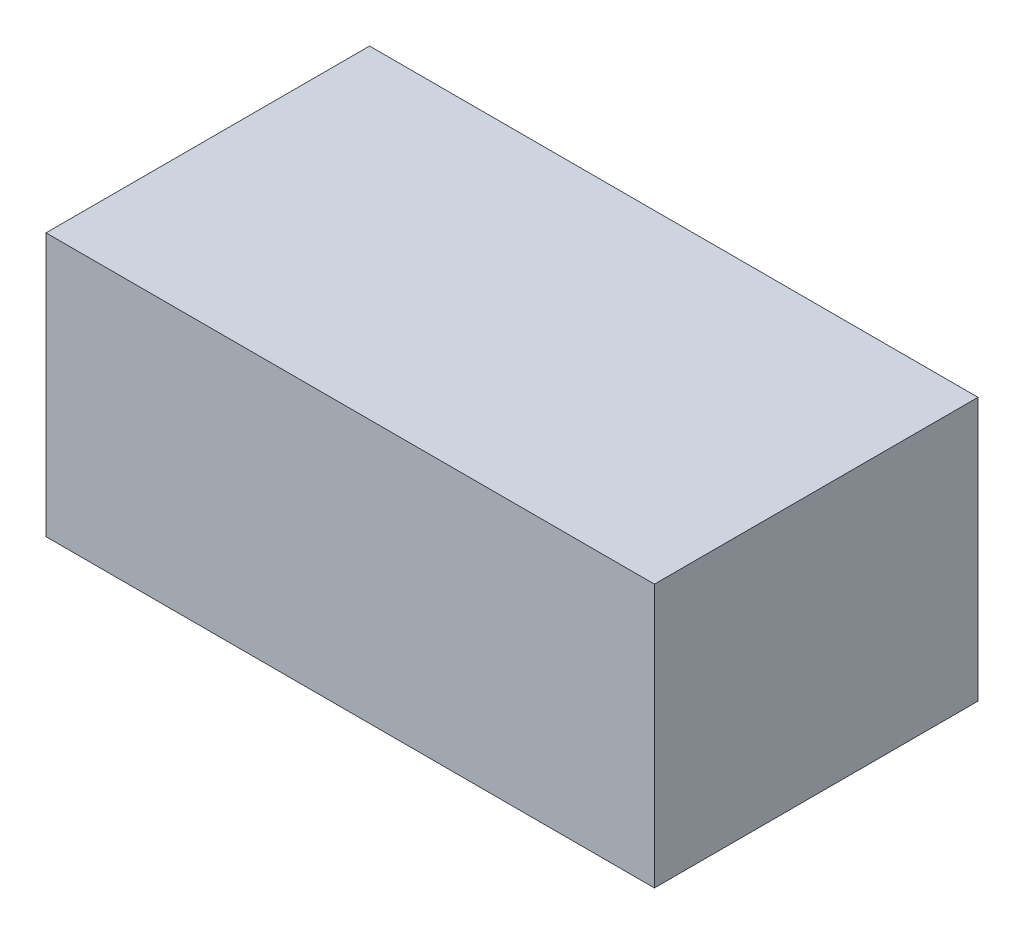
ISO-10303-21;
HEADER;
FILE_DESCRIPTION(('STEP AP214'),'2;1');
FILE_NAME('part.step','',(''),(''),'','','');
FILE_SCHEMA(('AUTOMOTIVE_DESIGN { 1 0 10303 214 1 1 1 1 }'));
ENDSEC;
DATA;
#1=APPLICATION_CONTEXT('core data for automotive mechanical design processes');
#2=APPLICATION_PROTOCOL_DEFINITION('international standard','automotive_design',2000,#1);
#3=PRODUCT_CONTEXT('',#1,'mechanical');
#4=PRODUCT('Part','Part','',(#3));
#5=PRODUCT_RELATED_PRODUCT_CATEGORY('part','',(#4));
#6=PRODUCT_DEFINITION_FORMATION('','',#4);
#7=PRODUCT_DEFINITION_CONTEXT('part definition',#1,'design');
#8=PRODUCT_DEFINITION('design','',#6,#7);
#9=PRODUCT_DEFINITION_SHAPE('','',#8);
#10=(LENGTH_UNIT() NAMED_UNIT(*) SI_UNIT(.MILLI.,.METRE.));
#11=(NAMED_UNIT(*) PLANE_ANGLE_UNIT() SI_UNIT($,.RADIAN.));
#12=(NAMED_UNIT(*) SI_UNIT($,.STERADIAN.) SOLID_ANGLE_UNIT());
#13=UNCERTAINTY_MEASURE_WITH_UNIT(LENGTH_MEASURE(1.E-05),#10,'distance_accuracy_value','');
#14=(GEOMETRIC_REPRESENTATION_CONTEXT(3) GLOBAL_UNCERTAINTY_ASSIGNED_CONTEXT((#13)) GLOBAL_UNIT_ASSIGNED_CONTEXT((#10,
#11,#12)) REPRESENTATION_CONTEXT('',''));
#15=CARTESIAN_POINT('',(0.,0.,0.));
#16=DIRECTION('',(0.,0.,1.));
#17=DIRECTION('',(1.,0.,0.));
#18=AXIS2_PLACEMENT_3D('',#15,#16,#17);
#19=CARTESIAN_POINT('',(-71.6421992077017,39.3581868210617,38.1));
#20=DIRECTION('',(1.,0.,0.));
#21=DIRECTION('',(0.,0.,-1.));
#22=AXIS2_PLACEMENT_3D('',#19,#20,#21);
#23=PLANE('',#22);
#24=DIRECTION('',(0.,0.,1.));
#25=VECTOR('',#24,1.);
#26=CARTESIAN_POINT('',(-71.6421992077017,0.,38.1));
#27=LINE('',#26,#25);
#28=CARTESIAN_POINT('',(-71.6421992077017,0.,0.));
#29=VERTEX_POINT('',#28);
#30=CARTESIAN_POINT('',(-71.6421992077017,0.,38.1));
#31=VERTEX_POINT('',#30);
#32=EDGE_CURVE('E88',#29,#31,#27,.T.);
#33=ORIENTED_EDGE('',*,*,#32,.F.);
#34=DIRECTION('',(0.,-1.,0.));
#35=VECTOR('',#34,1.);
#36=CARTESIAN_POINT('',(-71.6421992077017,39.3581868210617,0.));
#37=LINE('',#36,#35);
#38=CARTESIAN_POINT('',(-71.6421992077017,-30.984601046498,0.));
#39=VERTEX_POINT('',#38);
#40=EDGE_CURVE('E78',#29,#39,#37,.T.);
#41=ORIENTED_EDGE('',*,*,#40,.T.);
#42=DIRECTION('',(0.,0.,-1.));
#43=VECTOR('',#42,1.);
#44=CARTESIAN_POINT('',(-71.6421992077017,-30.984601046498,38.1));
#45=LINE('',#44,#43);
#46=CARTESIAN_POINT('',(-71.6421992077017,-30.984601046498,38.1));
#47=VERTEX_POINT('',#46);
#48=EDGE_CURVE('E44',#47,#39,#45,.T.);
#49=ORIENTED_EDGE('',*,*,#48,.F.);
#50=DIRECTION('',(0.,-1.,0.));
#51=VECTOR('',#50,1.);
#52=CARTESIAN_POINT('',(-71.6421992077017,39.3581868210617,38.1));
#53=LINE('',#52,#51);
#54=EDGE_CURVE('E89',#31,#47,#53,.T.);
#55=ORIENTED_EDGE('',*,*,#54,.F.);
#56=EDGE_LOOP('',(#33,#41,#49,#55));
#57=FACE_BOUND('',#56,.T.);
#58=ADVANCED_FACE('F37',(#57),#23,.F.);
#59=CARTESIAN_POINT('',(0.,39.3581868210617,38.1));
#60=DIRECTION('',(-1.,0.,0.));
#61=DIRECTION('',(0.,0.,1.));
#62=AXIS2_PLACEMENT_3D('',#59,#60,#61);
#63=PLANE('',#62);
#64=DIRECTION('',(0.,0.,-1.));
#65=VECTOR('',#64,1.);
#66=CARTESIAN_POINT('',(0.,0.,38.1));
#67=LINE('',#66,#65);
#68=CARTESIAN_POINT('',(0.,0.,38.1));
#69=VERTEX_POINT('',#68);
#70=CARTESIAN_POINT('',(0.,0.,0.));
#71=VERTEX_POINT('',#70);
#72=EDGE_CURVE('E51',#69,#71,#67,.T.);
#73=ORIENTED_EDGE('',*,*,#72,.F.);
#74=DIRECTION('',(0.,1.,0.));
#75=VECTOR('',#74,1.);
#76=CARTESIAN_POINT('',(0.,39.3581868210617,38.1));
#77=LINE('',#76,#75);
#78=CARTESIAN_POINT('',(0.,-30.984601046498,38.1));
#79=VERTEX_POINT('',#78);
#80=EDGE_CURVE('E100',#79,#69,#77,.T.);
#81=ORIENTED_EDGE('',*,*,#80,.F.);
#82=DIRECTION('',(0.,0.,-1.));
#83=VECTOR('',#82,1.);
#84=CARTESIAN_POINT('',(0.,-30.984601046498,38.1));
#85=LINE('',#84,#83);
#86=CARTESIAN_POINT('',(0.,-30.984601046498,0.));
#87=VERTEX_POINT('',#86);
#88=EDGE_CURVE('E101',#79,#87,#85,.T.);
#89=ORIENTED_EDGE('',*,*,#88,.T.);
#90=DIRECTION('',(0.,1.,0.));
#91=VECTOR('',#90,1.);
#92=CARTESIAN_POINT('',(0.,39.3581868210617,0.));
#93=LINE('',#92,#91);
#94=EDGE_CURVE('E98',#87,#71,#93,.T.);
#95=ORIENTED_EDGE('',*,*,#94,.T.);
#96=EDGE_LOOP('',(#73,#81,#89,#95));
#97=FACE_BOUND('',#96,.T.);
#98=ADVANCED_FACE('F111',(#97),#63,.F.);
#99=CARTESIAN_POINT('',(0.,0.,38.1));
#100=DIRECTION('',(0.,0.,1.));
#101=DIRECTION('',(1.,0.,0.));
#102=AXIS2_PLACEMENT_3D('',#99,#100,#101);
#103=PLANE('',#102);
#104=ORIENTED_EDGE('',*,*,#80,.T.);
#105=DIRECTION('',(-1.,0.,0.));
#106=VECTOR('',#105,1.);
#107=CARTESIAN_POINT('',(0.,0.,38.1));
#108=LINE('',#107,#106);
#109=EDGE_CURVE('E58',#69,#31,#108,.T.);
#110=ORIENTED_EDGE('',*,*,#109,.T.);
#111=ORIENTED_EDGE('',*,*,#54,.T.);
#112=DIRECTION('',(1.,0.,0.));
#113=VECTOR('',#112,1.);
#114=CARTESIAN_POINT('',(-71.6421992077017,-30.984601046498,38.1));
#115=LINE('',#114,#113);
#116=EDGE_CURVE('E97',#47,#79,#115,.T.);
#117=ORIENTED_EDGE('',*,*,#116,.T.);
#118=EDGE_LOOP('',(#104,#110,#111,#117));
#119=FACE_BOUND('',#118,.T.);
#120=ADVANCED_FACE('F110',(#119),#103,.T.);
#121=CARTESIAN_POINT('',(0.,0.,0.));
#122=DIRECTION('',(0.,0.,1.));
#123=DIRECTION('',(1.,0.,0.));
#124=AXIS2_PLACEMENT_3D('',#121,#122,#123);
#125=PLANE('',#124);
#126=DIRECTION('',(-1.,0.,0.));
#127=VECTOR('',#126,1.);
#128=CARTESIAN_POINT('',(0.,0.,0.));
#129=LINE('',#128,#127);
#130=EDGE_CURVE('E12',#71,#29,#129,.T.);
#131=ORIENTED_EDGE('',*,*,#130,.F.);
#132=ORIENTED_EDGE('',*,*,#94,.F.);
#133=DIRECTION('',(1.,0.,0.));
#134=VECTOR('',#133,1.);
#135=CARTESIAN_POINT('',(-71.6421992077017,-30.984601046498,0.));
#136=LINE('',#135,#134);
#137=EDGE_CURVE('E82',#39,#87,#136,.T.);
#138=ORIENTED_EDGE('',*,*,#137,.F.);
#139=ORIENTED_EDGE('',*,*,#40,.F.);
#140=EDGE_LOOP('',(#131,#132,#138,#139));
#141=FACE_BOUND('',#140,.T.);
#142=ADVANCED_FACE('F80',(#141),#125,.F.);
#143=CARTESIAN_POINT('',(-71.6421992077017,-30.984601046498,38.1));
#144=DIRECTION('',(0.,1.,0.));
#145=DIRECTION('',(0.,0.,1.));
#146=AXIS2_PLACEMENT_3D('',#143,#144,#145);
#147=PLANE('',#146);
#148=ORIENTED_EDGE('',*,*,#137,.T.);
#149=ORIENTED_EDGE('',*,*,#88,.F.);
#150=ORIENTED_EDGE('',*,*,#116,.F.);
#151=ORIENTED_EDGE('',*,*,#48,.T.);
#152=EDGE_LOOP('',(#148,#149,#150,#151));
#153=FACE_BOUND('',#152,.T.);
#154=ADVANCED_FACE('F108',(#153),#147,.F.);
#155=CARTESIAN_POINT('',(0.,0.,0.));
#156=DIRECTION('',(0.,1.,0.));
#157=DIRECTION('',(0.,0.,1.));
#158=AXIS2_PLACEMENT_3D('',#155,#156,#157);
#159=PLANE('',#158);
#160=ORIENTED_EDGE('',*,*,#109,.F.);
#161=ORIENTED_EDGE('',*,*,#72,.T.);
#162=ORIENTED_EDGE('',*,*,#130,.T.);
#163=ORIENTED_EDGE('',*,*,#32,.T.);
#164=EDGE_LOOP('',(#160,#161,#162,#163));
#165=FACE_BOUND('',#164,.T.);
#166=ADVANCED_FACE('F92',(#165),#159,.T.);
#167=CLOSED_SHELL('',(#58,#98,#120,#142,#154,#166));
#168=MANIFOLD_SOLID_BREP('B2',#167);
#169=ADVANCED_BREP_SHAPE_REPRESENTATION('',(#18,#168),#14);
#170=SHAPE_DEFINITION_REPRESENTATION(#9,#169);
ENDSEC;
END-ISO-10303-21;
